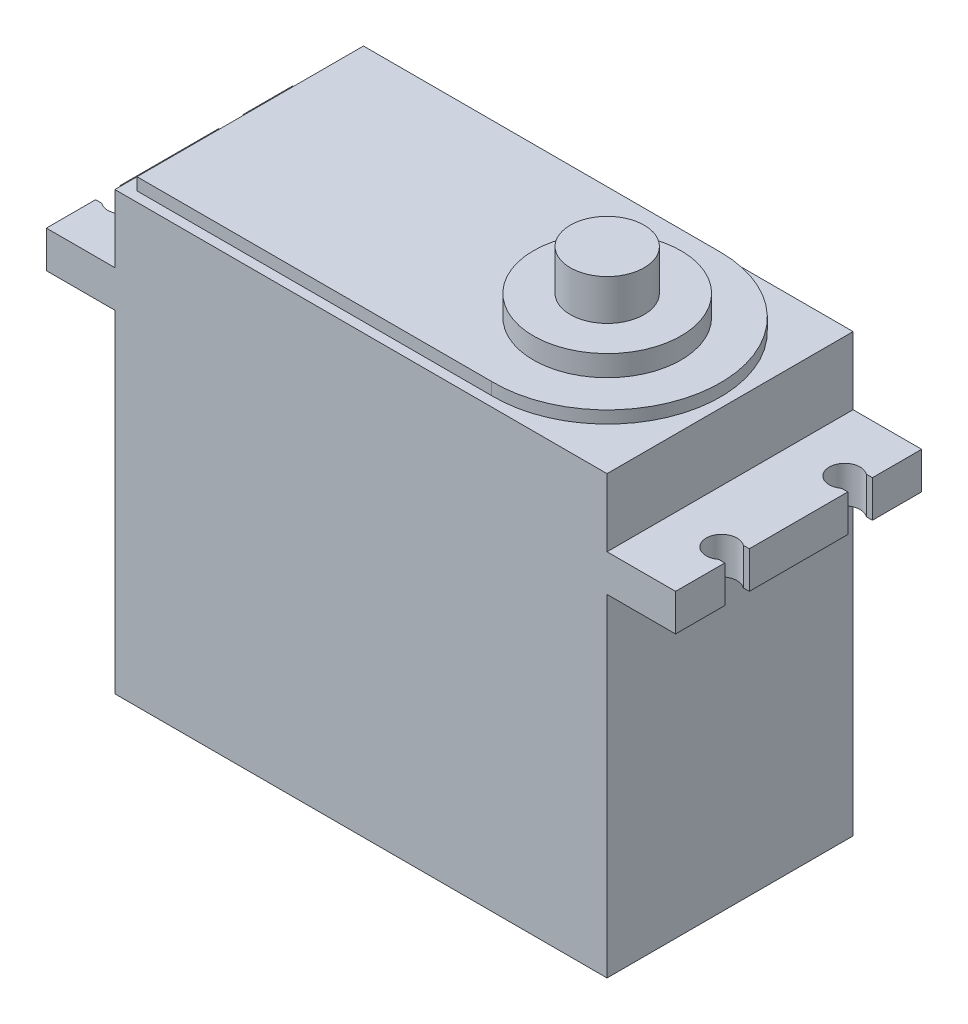
ISO-10303-21;
HEADER;
FILE_DESCRIPTION(('STEP AP214'),'2;1');
FILE_NAME('part.step','',(''),(''),'','','');
FILE_SCHEMA(('AUTOMOTIVE_DESIGN { 1 0 10303 214 1 1 1 1 }'));
ENDSEC;
DATA;
#1=APPLICATION_CONTEXT('core data for automotive mechanical design processes');
#2=APPLICATION_PROTOCOL_DEFINITION('international standard','automotive_design',2000,#1);
#3=PRODUCT_CONTEXT('',#1,'mechanical');
#4=PRODUCT('Part','Part','',(#3));
#5=PRODUCT_RELATED_PRODUCT_CATEGORY('part','',(#4));
#6=PRODUCT_DEFINITION_FORMATION('','',#4);
#7=PRODUCT_DEFINITION_CONTEXT('part definition',#1,'design');
#8=PRODUCT_DEFINITION('design','',#6,#7);
#9=PRODUCT_DEFINITION_SHAPE('','',#8);
#10=(LENGTH_UNIT() NAMED_UNIT(*) SI_UNIT(.MILLI.,.METRE.));
#11=(NAMED_UNIT(*) PLANE_ANGLE_UNIT() SI_UNIT($,.RADIAN.));
#12=(NAMED_UNIT(*) SI_UNIT($,.STERADIAN.) SOLID_ANGLE_UNIT());
#13=UNCERTAINTY_MEASURE_WITH_UNIT(LENGTH_MEASURE(1.E-05),#10,'distance_accuracy_value','');
#14=(GEOMETRIC_REPRESENTATION_CONTEXT(3) GLOBAL_UNCERTAINTY_ASSIGNED_CONTEXT((#13)) GLOBAL_UNIT_ASSIGNED_CONTEXT((#10,
#11,#12)) REPRESENTATION_CONTEXT('',''));
#15=CARTESIAN_POINT('',(0.,0.,0.));
#16=DIRECTION('',(0.,0.,1.));
#17=DIRECTION('',(1.,0.,0.));
#18=AXIS2_PLACEMENT_3D('',#15,#16,#17);
#19=CARTESIAN_POINT('',(20.,4.73208454498427,10.));
#20=DIRECTION('',(0.,-1.,0.));
#21=DIRECTION('',(1.,0.,0.));
#22=AXIS2_PLACEMENT_3D('',#19,#20,#21);
#23=PLANE('',#22);
#24=DIRECTION('',(-1.,0.,0.));
#25=VECTOR('',#24,1.);
#26=CARTESIAN_POINT('',(20.,4.73208454498427,-10.));
#27=LINE('',#26,#25);
#28=CARTESIAN_POINT('',(20.,4.73208454498427,-10.));
#29=VERTEX_POINT('',#28);
#30=CARTESIAN_POINT('',(-20.,4.73208454498424,-10.));
#31=VERTEX_POINT('',#30);
#32=EDGE_CURVE('E373',#29,#31,#27,.T.);
#33=ORIENTED_EDGE('',*,*,#32,.T.);
#34=DIRECTION('',(0.,0.,-1.));
#35=VECTOR('',#34,1.);
#36=CARTESIAN_POINT('',(-20.,4.73208454498424,10.));
#37=LINE('',#36,#35);
#38=CARTESIAN_POINT('',(-20.,4.73208454498424,10.));
#39=VERTEX_POINT('',#38);
#40=EDGE_CURVE('E422',#39,#31,#37,.T.);
#41=ORIENTED_EDGE('',*,*,#40,.F.);
#42=DIRECTION('',(-1.,0.,0.));
#43=VECTOR('',#42,1.);
#44=CARTESIAN_POINT('',(20.,4.73208454498427,10.));
#45=LINE('',#44,#43);
#46=CARTESIAN_POINT('',(20.,4.73208454498427,10.));
#47=VERTEX_POINT('',#46);
#48=EDGE_CURVE('E348',#47,#39,#45,.T.);
#49=ORIENTED_EDGE('',*,*,#48,.F.);
#50=DIRECTION('',(0.,0.,-1.));
#51=VECTOR('',#50,1.);
#52=CARTESIAN_POINT('',(20.,4.73208454498427,10.));
#53=LINE('',#52,#51);
#54=EDGE_CURVE('E425',#47,#29,#53,.T.);
#55=ORIENTED_EDGE('',*,*,#54,.T.);
#56=EDGE_LOOP('',(#33,#41,#49,#55));
#57=FACE_BOUND('',#56,.T.);
#58=DIRECTION('',(0.,0.,1.));
#59=VECTOR('',#58,1.);
#60=CARTESIAN_POINT('',(-19.,4.73208454498424,-9.20251188534956));
#61=LINE('',#60,#59);
#62=CARTESIAN_POINT('',(-19.,4.73208454498424,-9.20251188534956));
#63=VERTEX_POINT('',#62);
#64=CARTESIAN_POINT('',(-19.,4.73208454498424,9.2));
#65=VERTEX_POINT('',#64);
#66=EDGE_CURVE('E263',#63,#65,#61,.T.);
#67=ORIENTED_EDGE('',*,*,#66,.F.);
#68=DIRECTION('',(-1.,0.,0.));
#69=VECTOR('',#68,1.);
#70=CARTESIAN_POINT('',(-19.,4.73208454498424,-9.20251188534956));
#71=LINE('',#70,#69);
#72=CARTESIAN_POINT('',(10.015,4.73208454498426,-9.20251188534956));
#73=VERTEX_POINT('',#72);
#74=EDGE_CURVE('E260',#73,#63,#71,.T.);
#75=ORIENTED_EDGE('',*,*,#74,.F.);
#76=CARTESIAN_POINT('',(10.015,4.73208454498426,0.));
#77=DIRECTION('',(0.,1.,0.));
#78=DIRECTION('',(-1.,0.,0.));
#79=AXIS2_PLACEMENT_3D('',#76,#77,#78);
#80=CIRCLE('',#79,9.20251188534956);
#81=CARTESIAN_POINT('',(9.8,4.73208454498426,9.2));
#82=VERTEX_POINT('',#81);
#83=EDGE_CURVE('E54',#82,#73,#80,.T.);
#84=ORIENTED_EDGE('',*,*,#83,.F.);
#85=DIRECTION('',(1.,0.,0.));
#86=VECTOR('',#85,1.);
#87=CARTESIAN_POINT('',(-19.,4.73208454498424,9.2));
#88=LINE('',#87,#86);
#89=EDGE_CURVE('E49',#65,#82,#88,.T.);
#90=ORIENTED_EDGE('',*,*,#89,.F.);
#91=EDGE_LOOP('',(#67,#75,#84,#90));
#92=FACE_BOUND('',#91,.T.);
#93=ADVANCED_FACE('F33',(#57,#92),#23,.F.);
#94=CARTESIAN_POINT('',(25.5688776328022,-0.767915455015733,10.));
#95=DIRECTION('',(-1.,0.,0.));
#96=DIRECTION('',(0.,0.,1.));
#97=AXIS2_PLACEMENT_3D('',#94,#95,#96);
#98=PLANE('',#97);
#99=DIRECTION('',(0.,0.,-1.));
#100=VECTOR('',#99,1.);
#101=CARTESIAN_POINT('',(25.5688776328022,-0.767915455015733,10.));
#102=LINE('',#101,#100);
#103=CARTESIAN_POINT('',(25.5688776328022,-0.767915455015733,4.));
#104=VERTEX_POINT('',#103);
#105=CARTESIAN_POINT('',(25.5688776328022,-0.767915455015733,-4.));
#106=VERTEX_POINT('',#105);
#107=EDGE_CURVE('E436',#104,#106,#102,.T.);
#108=ORIENTED_EDGE('',*,*,#107,.F.);
#109=DIRECTION('',(0.,1.,0.));
#110=VECTOR('',#109,1.);
#111=CARTESIAN_POINT('',(25.5688776328022,-10.7679154550157,4.));
#112=LINE('',#111,#110);
#113=CARTESIAN_POINT('',(25.5688776328022,-3.76791545501573,4.));
#114=VERTEX_POINT('',#113);
#115=EDGE_CURVE('E283',#114,#104,#112,.T.);
#116=ORIENTED_EDGE('',*,*,#115,.F.);
#117=DIRECTION('',(0.,0.,-1.));
#118=VECTOR('',#117,1.);
#119=CARTESIAN_POINT('',(25.5688776328022,-3.76791545501573,10.));
#120=LINE('',#119,#118);
#121=CARTESIAN_POINT('',(25.5688776328022,-3.76791545501573,-4.));
#122=VERTEX_POINT('',#121);
#123=EDGE_CURVE('E397',#114,#122,#120,.T.);
#124=ORIENTED_EDGE('',*,*,#123,.T.);
#125=DIRECTION('',(0.,1.,0.));
#126=VECTOR('',#125,1.);
#127=CARTESIAN_POINT('',(25.5688776328022,-10.7679154550157,-4.));
#128=LINE('',#127,#126);
#129=EDGE_CURVE('E334',#122,#106,#128,.T.);
#130=ORIENTED_EDGE('',*,*,#129,.T.);
#131=EDGE_LOOP('',(#108,#116,#124,#130));
#132=FACE_BOUND('',#131,.T.);
#133=ADVANCED_FACE('F496',(#132),#98,.F.);
#134=CARTESIAN_POINT('',(-20.,-0.767915455015747,10.));
#135=DIRECTION('',(0.,-1.,0.));
#136=DIRECTION('',(0.,0.,-1.));
#137=AXIS2_PLACEMENT_3D('',#134,#135,#136);
#138=PLANE('',#137);
#139=CARTESIAN_POINT('',(-24.315,-0.767915455015733,-5.));
#140=DIRECTION('',(0.,1.,0.));
#141=DIRECTION('',(0.,0.,1.));
#142=AXIS2_PLACEMENT_3D('',#139,#140,#141);
#143=CIRCLE('',#142,1.25387763280224);
#144=CARTESIAN_POINT('',(-25.07144505289,-0.767915455015733,-5.99999999999999));
#145=VERTEX_POINT('',#144);
#146=CARTESIAN_POINT('',(-25.07144505289,-0.767915455015733,-4.00000000000001));
#147=VERTEX_POINT('',#146);
#148=EDGE_CURVE('E292',#145,#147,#143,.F.);
#149=ORIENTED_EDGE('',*,*,#148,.T.);
#150=DIRECTION('',(1.,0.,0.));
#151=VECTOR('',#150,1.);
#152=CARTESIAN_POINT('',(0.,-0.767915455015733,-4.00000000000062));
#153=LINE('',#152,#151);
#154=CARTESIAN_POINT('',(-25.5688776328022,-0.767915455015733,-3.99999999999999));
#155=VERTEX_POINT('',#154);
#156=EDGE_CURVE('E298',#155,#147,#153,.T.);
#157=ORIENTED_EDGE('',*,*,#156,.F.);
#158=DIRECTION('',(0.,0.,-1.));
#159=VECTOR('',#158,1.);
#160=CARTESIAN_POINT('',(-25.5688776328022,-0.767915455015747,10.));
#161=LINE('',#160,#159);
#162=CARTESIAN_POINT('',(-25.5688776328022,-0.767915455015733,3.99999999999999));
#163=VERTEX_POINT('',#162);
#164=EDGE_CURVE('E419',#163,#155,#161,.T.);
#165=ORIENTED_EDGE('',*,*,#164,.F.);
#166=DIRECTION('',(1.,0.,0.));
#167=VECTOR('',#166,1.);
#168=CARTESIAN_POINT('',(0.,-0.767915455015733,4.00000000000062));
#169=LINE('',#168,#167);
#170=CARTESIAN_POINT('',(-25.07144505289,-0.767915455015733,4.00000000000001));
#171=VERTEX_POINT('',#170);
#172=EDGE_CURVE('E267',#163,#171,#169,.T.);
#173=ORIENTED_EDGE('',*,*,#172,.T.);
#174=CARTESIAN_POINT('',(-24.315,-0.767915455015733,5.));
#175=DIRECTION('',(0.,1.,0.));
#176=DIRECTION('',(0.,0.,1.));
#177=AXIS2_PLACEMENT_3D('',#174,#175,#176);
#178=CIRCLE('',#177,1.25387763280224);
#179=CARTESIAN_POINT('',(-25.07144505289,-0.767915455015733,5.99999999999999));
#180=VERTEX_POINT('',#179);
#181=EDGE_CURVE('E264',#171,#180,#178,.F.);
#182=ORIENTED_EDGE('',*,*,#181,.T.);
#183=DIRECTION('',(-1.,0.,0.));
#184=VECTOR('',#183,1.);
#185=CARTESIAN_POINT('',(1.46468866200668E-13,-0.767915455015733,5.99999999999938));
#186=LINE('',#185,#184);
#187=CARTESIAN_POINT('',(-25.5688776328022,-0.767915455015733,6.00000000000001));
#188=VERTEX_POINT('',#187);
#189=EDGE_CURVE('E311',#180,#188,#186,.T.);
#190=ORIENTED_EDGE('',*,*,#189,.T.);
#191=CARTESIAN_POINT('',(-25.5688776328022,-0.767915455015747,10.));
#192=VERTEX_POINT('',#191);
#193=EDGE_CURVE('E415',#192,#188,#161,.T.);
#194=ORIENTED_EDGE('',*,*,#193,.F.);
#195=DIRECTION('',(-1.,0.,0.));
#196=VECTOR('',#195,1.);
#197=CARTESIAN_POINT('',(-20.,-0.767915455015747,10.));
#198=LINE('',#197,#196);
#199=CARTESIAN_POINT('',(-20.,-0.767915455015747,10.));
#200=VERTEX_POINT('',#199);
#201=EDGE_CURVE('E352',#200,#192,#198,.T.);
#202=ORIENTED_EDGE('',*,*,#201,.F.);
#203=DIRECTION('',(0.,0.,-1.));
#204=VECTOR('',#203,1.);
#205=CARTESIAN_POINT('',(-20.,-0.767915455015747,10.));
#206=LINE('',#205,#204);
#207=CARTESIAN_POINT('',(-20.,-0.767915455015747,-10.));
#208=VERTEX_POINT('',#207);
#209=EDGE_CURVE('E418',#200,#208,#206,.T.);
#210=ORIENTED_EDGE('',*,*,#209,.T.);
#211=DIRECTION('',(-1.,0.,0.));
#212=VECTOR('',#211,1.);
#213=CARTESIAN_POINT('',(-20.,-0.767915455015747,-10.));
#214=LINE('',#213,#212);
#215=CARTESIAN_POINT('',(-25.5688776328022,-0.767915455015747,-10.));
#216=VERTEX_POINT('',#215);
#217=EDGE_CURVE('E377',#208,#216,#214,.T.);
#218=ORIENTED_EDGE('',*,*,#217,.T.);
#219=CARTESIAN_POINT('',(-25.5688776328022,-0.767915455015733,-6.00000000000001));
#220=VERTEX_POINT('',#219);
#221=EDGE_CURVE('E413',#220,#216,#161,.T.);
#222=ORIENTED_EDGE('',*,*,#221,.F.);
#223=DIRECTION('',(-1.,0.,0.));
#224=VECTOR('',#223,1.);
#225=CARTESIAN_POINT('',(1.46468866200668E-13,-0.767915455015733,-5.99999999999938));
#226=LINE('',#225,#224);
#227=EDGE_CURVE('E295',#145,#220,#226,.T.);
#228=ORIENTED_EDGE('',*,*,#227,.F.);
#229=EDGE_LOOP('',(#149,#157,#165,#173,#182,#190,#194,#202,#210,#218,#222,#228));
#230=FACE_BOUND('',#229,.T.);
#231=ADVANCED_FACE('F531',(#230),#138,.F.);
#232=CARTESIAN_POINT('',(-25.5688776328022,-0.767915455015747,10.));
#233=DIRECTION('',(1.,0.,0.));
#234=DIRECTION('',(0.,0.,-1.));
#235=AXIS2_PLACEMENT_3D('',#232,#233,#234);
#236=PLANE('',#235);
#237=ORIENTED_EDGE('',*,*,#164,.T.);
#238=DIRECTION('',(0.,1.,0.));
#239=VECTOR('',#238,1.);
#240=CARTESIAN_POINT('',(-25.5688776328022,-10.7679154550157,-3.99999999999999));
#241=LINE('',#240,#239);
#242=CARTESIAN_POINT('',(-25.5688776328022,-3.76791545501575,-3.99999999999999));
#243=VERTEX_POINT('',#242);
#244=EDGE_CURVE('E303',#243,#155,#241,.T.);
#245=ORIENTED_EDGE('',*,*,#244,.F.);
#246=DIRECTION('',(0.,0.,-1.));
#247=VECTOR('',#246,1.);
#248=CARTESIAN_POINT('',(-25.5688776328022,-3.76791545501575,10.));
#249=LINE('',#248,#247);
#250=CARTESIAN_POINT('',(-25.5688776328022,-3.76791545501575,4.));
#251=VERTEX_POINT('',#250);
#252=EDGE_CURVE('E414',#251,#243,#249,.T.);
#253=ORIENTED_EDGE('',*,*,#252,.F.);
#254=DIRECTION('',(0.,1.,0.));
#255=VECTOR('',#254,1.);
#256=CARTESIAN_POINT('',(-25.5688776328022,-10.7679154550157,3.99999999999999));
#257=LINE('',#256,#255);
#258=EDGE_CURVE('E318',#251,#163,#257,.T.);
#259=ORIENTED_EDGE('',*,*,#258,.T.);
#260=EDGE_LOOP('',(#237,#245,#253,#259));
#261=FACE_BOUND('',#260,.T.);
#262=ADVANCED_FACE('F588',(#261),#236,.F.);
#263=DIRECTION('',(0.,1.,0.));
#264=VECTOR('',#263,1.);
#265=CARTESIAN_POINT('',(-25.5688776328022,-10.7679154550157,6.00000000000001));
#266=LINE('',#265,#264);
#267=CARTESIAN_POINT('',(-25.5688776328022,-3.76791545501575,6.00000000000001));
#268=VERTEX_POINT('',#267);
#269=EDGE_CURVE('E316',#268,#188,#266,.T.);
#270=ORIENTED_EDGE('',*,*,#269,.F.);
#271=CARTESIAN_POINT('',(-25.5688776328022,-3.76791545501575,10.));
#272=VERTEX_POINT('',#271);
#273=EDGE_CURVE('E410',#272,#268,#249,.T.);
#274=ORIENTED_EDGE('',*,*,#273,.F.);
#275=DIRECTION('',(0.,-1.,0.));
#276=VECTOR('',#275,1.);
#277=CARTESIAN_POINT('',(-25.5688776328022,-0.767915455015747,10.));
#278=LINE('',#277,#276);
#279=EDGE_CURVE('E354',#192,#272,#278,.T.);
#280=ORIENTED_EDGE('',*,*,#279,.F.);
#281=ORIENTED_EDGE('',*,*,#193,.T.);
#282=EDGE_LOOP('',(#270,#274,#280,#281));
#283=FACE_BOUND('',#282,.T.);
#284=ADVANCED_FACE('F535',(#283),#236,.F.);
#285=CARTESIAN_POINT('',(-25.5688776328022,-3.76791545501575,-6.));
#286=VERTEX_POINT('',#285);
#287=CARTESIAN_POINT('',(-25.5688776328022,-3.76791545501575,-10.));
#288=VERTEX_POINT('',#287);
#289=EDGE_CURVE('E409',#286,#288,#249,.T.);
#290=ORIENTED_EDGE('',*,*,#289,.F.);
#291=DIRECTION('',(0.,1.,0.));
#292=VECTOR('',#291,1.);
#293=CARTESIAN_POINT('',(-25.5688776328022,-10.7679154550157,-6.00000000000001));
#294=LINE('',#293,#292);
#295=EDGE_CURVE('E305',#286,#220,#294,.T.);
#296=ORIENTED_EDGE('',*,*,#295,.T.);
#297=ORIENTED_EDGE('',*,*,#221,.T.);
#298=DIRECTION('',(0.,-1.,0.));
#299=VECTOR('',#298,1.);
#300=CARTESIAN_POINT('',(-25.5688776328022,-0.767915455015747,-10.));
#301=LINE('',#300,#299);
#302=EDGE_CURVE('E380',#216,#288,#301,.T.);
#303=ORIENTED_EDGE('',*,*,#302,.T.);
#304=EDGE_LOOP('',(#290,#296,#297,#303));
#305=FACE_BOUND('',#304,.T.);
#306=ADVANCED_FACE('F581',(#305),#236,.F.);
#307=CARTESIAN_POINT('',(-25.5688776328022,-3.76791545501575,10.));
#308=DIRECTION('',(0.,1.,0.));
#309=DIRECTION('',(-1.,0.,0.));
#310=AXIS2_PLACEMENT_3D('',#307,#308,#309);
#311=PLANE('',#310);
#312=ORIENTED_EDGE('',*,*,#252,.T.);
#313=DIRECTION('',(1.,0.,0.));
#314=VECTOR('',#313,1.);
#315=CARTESIAN_POINT('',(-25.5688776328026,-3.76791545501575,-3.99999999999999));
#316=LINE('',#315,#314);
#317=CARTESIAN_POINT('',(-25.07144505289,-3.76791545501575,-4.00000000000001));
#318=VERTEX_POINT('',#317);
#319=EDGE_CURVE('E455',#243,#318,#316,.T.);
#320=ORIENTED_EDGE('',*,*,#319,.T.);
#321=CARTESIAN_POINT('',(-24.315,-3.76791545501575,-5.));
#322=DIRECTION('',(0.,1.,0.));
#323=DIRECTION('',(-1.,0.,0.));
#324=AXIS2_PLACEMENT_3D('',#321,#322,#323);
#325=CIRCLE('',#324,1.25387763280224);
#326=CARTESIAN_POINT('',(-25.07144505289,-3.76791545501575,-5.99999999999999));
#327=VERTEX_POINT('',#326);
#328=EDGE_CURVE('E453',#327,#318,#325,.F.);
#329=ORIENTED_EDGE('',*,*,#328,.F.);
#330=DIRECTION('',(-1.,0.,0.));
#331=VECTOR('',#330,1.);
#332=CARTESIAN_POINT('',(-25.5688776328018,-3.76791545501575,-6.00000000000001));
#333=LINE('',#332,#331);
#334=EDGE_CURVE('E450',#327,#286,#333,.T.);
#335=ORIENTED_EDGE('',*,*,#334,.T.);
#336=ORIENTED_EDGE('',*,*,#289,.T.);
#337=DIRECTION('',(1.,0.,0.));
#338=VECTOR('',#337,1.);
#339=CARTESIAN_POINT('',(-25.5688776328022,-3.76791545501575,-10.));
#340=LINE('',#339,#338);
#341=CARTESIAN_POINT('',(-20.,-3.76791545501575,-10.));
#342=VERTEX_POINT('',#341);
#343=EDGE_CURVE('E383',#288,#342,#340,.T.);
#344=ORIENTED_EDGE('',*,*,#343,.T.);
#345=DIRECTION('',(0.,0.,-1.));
#346=VECTOR('',#345,1.);
#347=CARTESIAN_POINT('',(-20.,-3.76791545501575,10.));
#348=LINE('',#347,#346);
#349=CARTESIAN_POINT('',(-20.,-3.76791545501575,10.));
#350=VERTEX_POINT('',#349);
#351=EDGE_CURVE('E406',#350,#342,#348,.T.);
#352=ORIENTED_EDGE('',*,*,#351,.F.);
#353=DIRECTION('',(1.,0.,0.));
#354=VECTOR('',#353,1.);
#355=CARTESIAN_POINT('',(-25.5688776328022,-3.76791545501575,10.));
#356=LINE('',#355,#354);
#357=EDGE_CURVE('E356',#272,#350,#356,.T.);
#358=ORIENTED_EDGE('',*,*,#357,.F.);
#359=ORIENTED_EDGE('',*,*,#273,.T.);
#360=DIRECTION('',(-1.,0.,0.));
#361=VECTOR('',#360,1.);
#362=CARTESIAN_POINT('',(-25.5688776328023,-3.76791545501575,6.00000000000001));
#363=LINE('',#362,#361);
#364=CARTESIAN_POINT('',(-25.07144505289,-3.76791545501575,5.99999999999999));
#365=VERTEX_POINT('',#364);
#366=EDGE_CURVE('E448',#365,#268,#363,.T.);
#367=ORIENTED_EDGE('',*,*,#366,.F.);
#368=CARTESIAN_POINT('',(-24.315,-3.76791545501575,5.));
#369=DIRECTION('',(0.,1.,0.));
#370=DIRECTION('',(-1.,0.,0.));
#371=AXIS2_PLACEMENT_3D('',#368,#369,#370);
#372=CIRCLE('',#371,1.25387763280224);
#373=CARTESIAN_POINT('',(-25.07144505289,-3.76791545501575,4.00000000000001));
#374=VERTEX_POINT('',#373);
#375=EDGE_CURVE('E446',#374,#365,#372,.F.);
#376=ORIENTED_EDGE('',*,*,#375,.F.);
#377=DIRECTION('',(1.,0.,0.));
#378=VECTOR('',#377,1.);
#379=CARTESIAN_POINT('',(-25.5688776328021,-3.76791545501575,3.99999999999999));
#380=LINE('',#379,#378);
#381=EDGE_CURVE('E444',#251,#374,#380,.T.);
#382=ORIENTED_EDGE('',*,*,#381,.F.);
#383=EDGE_LOOP('',(#312,#320,#329,#335,#336,#344,#352,#358,#359,#367,#376,#382));
#384=FACE_BOUND('',#383,.T.);
#385=ADVANCED_FACE('F541',(#384),#311,.F.);
#386=DIRECTION('',(0.,1.,0.));
#387=VECTOR('',#386,1.);
#388=CARTESIAN_POINT('',(25.5688776328022,-10.7679154550157,-6.));
#389=LINE('',#388,#387);
#390=CARTESIAN_POINT('',(25.5688776328022,-3.76791545501573,-6.));
#391=VERTEX_POINT('',#390);
#392=CARTESIAN_POINT('',(25.5688776328022,-0.767915455015733,-6.));
#393=VERTEX_POINT('',#392);
#394=EDGE_CURVE('E331',#391,#393,#389,.T.);
#395=ORIENTED_EDGE('',*,*,#394,.F.);
#396=CARTESIAN_POINT('',(25.5688776328022,-3.76791545501573,-10.));
#397=VERTEX_POINT('',#396);
#398=EDGE_CURVE('E366',#391,#397,#120,.T.);
#399=ORIENTED_EDGE('',*,*,#398,.T.);
#400=DIRECTION('',(0.,1.,0.));
#401=VECTOR('',#400,1.);
#402=CARTESIAN_POINT('',(25.5688776328022,-0.767915455015733,-10.));
#403=LINE('',#402,#401);
#404=CARTESIAN_POINT('',(25.5688776328022,-0.767915455015733,-10.));
#405=VERTEX_POINT('',#404);
#406=EDGE_CURVE('E333',#397,#405,#403,.T.);
#407=ORIENTED_EDGE('',*,*,#406,.T.);
#408=EDGE_CURVE('E431',#393,#405,#102,.T.);
#409=ORIENTED_EDGE('',*,*,#408,.F.);
#410=EDGE_LOOP('',(#395,#399,#407,#409));
#411=FACE_BOUND('',#410,.T.);
#412=ADVANCED_FACE('F35',(#411),#98,.F.);
#413=CARTESIAN_POINT('',(25.5688776328022,-3.76791545501573,10.));
#414=VERTEX_POINT('',#413);
#415=CARTESIAN_POINT('',(25.5688776328022,-3.76791545501573,6.));
#416=VERTEX_POINT('',#415);
#417=EDGE_CURVE('E393',#414,#416,#120,.T.);
#418=ORIENTED_EDGE('',*,*,#417,.T.);
#419=DIRECTION('',(0.,1.,0.));
#420=VECTOR('',#419,1.);
#421=CARTESIAN_POINT('',(25.5688776328022,-10.7679154550157,6.));
#422=LINE('',#421,#420);
#423=CARTESIAN_POINT('',(25.5688776328022,-0.767915455015733,6.));
#424=VERTEX_POINT('',#423);
#425=EDGE_CURVE('E286',#416,#424,#422,.T.);
#426=ORIENTED_EDGE('',*,*,#425,.T.);
#427=CARTESIAN_POINT('',(25.5688776328022,-0.767915455015733,10.));
#428=VERTEX_POINT('',#427);
#429=EDGE_CURVE('E432',#428,#424,#102,.T.);
#430=ORIENTED_EDGE('',*,*,#429,.F.);
#431=DIRECTION('',(0.,1.,0.));
#432=VECTOR('',#431,1.);
#433=CARTESIAN_POINT('',(25.5688776328022,-0.767915455015733,10.));
#434=LINE('',#433,#432);
#435=EDGE_CURVE('E340',#414,#428,#434,.T.);
#436=ORIENTED_EDGE('',*,*,#435,.F.);
#437=EDGE_LOOP('',(#418,#426,#430,#436));
#438=FACE_BOUND('',#437,.T.);
#439=ADVANCED_FACE('F471',(#438),#98,.F.);
#440=CARTESIAN_POINT('',(20.,-0.767915455015733,10.));
#441=DIRECTION('',(0.,-1.,0.));
#442=DIRECTION('',(0.,0.,-1.));
#443=AXIS2_PLACEMENT_3D('',#440,#441,#442);
#444=PLANE('',#443);
#445=CARTESIAN_POINT('',(24.315,-0.767915455015733,5.));
#446=DIRECTION('',(0.,1.,0.));
#447=DIRECTION('',(0.,0.,1.));
#448=AXIS2_PLACEMENT_3D('',#445,#446,#447);
#449=CIRCLE('',#448,1.25387763280224);
#450=CARTESIAN_POINT('',(25.07144505289,-0.767915455015733,4.));
#451=VERTEX_POINT('',#450);
#452=CARTESIAN_POINT('',(25.07144505289,-0.767915455015733,6.));
#453=VERTEX_POINT('',#452);
#454=EDGE_CURVE('E276',#451,#453,#449,.T.);
#455=ORIENTED_EDGE('',*,*,#454,.F.);
#456=DIRECTION('',(-1.,0.,0.));
#457=VECTOR('',#456,1.);
#458=CARTESIAN_POINT('',(0.,-0.767915455015733,4.));
#459=LINE('',#458,#457);
#460=EDGE_CURVE('E273',#104,#451,#459,.T.);
#461=ORIENTED_EDGE('',*,*,#460,.F.);
#462=ORIENTED_EDGE('',*,*,#107,.T.);
#463=DIRECTION('',(-1.,0.,0.));
#464=VECTOR('',#463,1.);
#465=CARTESIAN_POINT('',(0.,-0.767915455015733,-4.));
#466=LINE('',#465,#464);
#467=CARTESIAN_POINT('',(25.07144505289,-0.767915455015733,-4.));
#468=VERTEX_POINT('',#467);
#469=EDGE_CURVE('E327',#106,#468,#466,.T.);
#470=ORIENTED_EDGE('',*,*,#469,.T.);
#471=CARTESIAN_POINT('',(24.315,-0.767915455015733,-5.));
#472=DIRECTION('',(0.,1.,0.));
#473=DIRECTION('',(0.,0.,1.));
#474=AXIS2_PLACEMENT_3D('',#471,#472,#473);
#475=CIRCLE('',#474,1.25387763280224);
#476=CARTESIAN_POINT('',(25.07144505289,-0.767915455015733,-6.));
#477=VERTEX_POINT('',#476);
#478=EDGE_CURVE('E324',#477,#468,#475,.T.);
#479=ORIENTED_EDGE('',*,*,#478,.F.);
#480=DIRECTION('',(1.,0.,0.));
#481=VECTOR('',#480,1.);
#482=CARTESIAN_POINT('',(0.,-0.767915455015733,-6.));
#483=LINE('',#482,#481);
#484=EDGE_CURVE('E285',#477,#393,#483,.T.);
#485=ORIENTED_EDGE('',*,*,#484,.T.);
#486=ORIENTED_EDGE('',*,*,#408,.T.);
#487=DIRECTION('',(-1.,0.,0.));
#488=VECTOR('',#487,1.);
#489=CARTESIAN_POINT('',(20.,-0.767915455015733,-10.));
#490=LINE('',#489,#488);
#491=CARTESIAN_POINT('',(20.,-0.767915455015733,-10.));
#492=VERTEX_POINT('',#491);
#493=EDGE_CURVE('E369',#405,#492,#490,.T.);
#494=ORIENTED_EDGE('',*,*,#493,.T.);
#495=DIRECTION('',(0.,0.,-1.));
#496=VECTOR('',#495,1.);
#497=CARTESIAN_POINT('',(20.,-0.767915455015733,10.));
#498=LINE('',#497,#496);
#499=CARTESIAN_POINT('',(20.,-0.767915455015733,10.));
#500=VERTEX_POINT('',#499);
#501=EDGE_CURVE('E428',#500,#492,#498,.T.);
#502=ORIENTED_EDGE('',*,*,#501,.F.);
#503=DIRECTION('',(-1.,0.,0.));
#504=VECTOR('',#503,1.);
#505=CARTESIAN_POINT('',(20.,-0.767915455015733,10.));
#506=LINE('',#505,#504);
#507=EDGE_CURVE('E343',#428,#500,#506,.T.);
#508=ORIENTED_EDGE('',*,*,#507,.F.);
#509=ORIENTED_EDGE('',*,*,#429,.T.);
#510=DIRECTION('',(1.,0.,0.));
#511=VECTOR('',#510,1.);
#512=CARTESIAN_POINT('',(0.,-0.767915455015733,6.));
#513=LINE('',#512,#511);
#514=EDGE_CURVE('E280',#453,#424,#513,.T.);
#515=ORIENTED_EDGE('',*,*,#514,.F.);
#516=EDGE_LOOP('',(#455,#461,#462,#470,#479,#485,#486,#494,#502,#508,#509,#515));
#517=FACE_BOUND('',#516,.T.);
#518=ADVANCED_FACE('F510',(#517),#444,.F.);
#519=CARTESIAN_POINT('',(25.5688776328022,-3.76791545501573,10.));
#520=DIRECTION('',(0.,1.,0.));
#521=DIRECTION('',(-1.,0.,0.));
#522=AXIS2_PLACEMENT_3D('',#519,#520,#521);
#523=PLANE('',#522);
#524=ORIENTED_EDGE('',*,*,#123,.F.);
#525=DIRECTION('',(-1.,0.,0.));
#526=VECTOR('',#525,1.);
#527=CARTESIAN_POINT('',(25.5688776328022,-3.76791545501573,4.));
#528=LINE('',#527,#526);
#529=CARTESIAN_POINT('',(25.07144505289,-3.76791545501573,4.));
#530=VERTEX_POINT('',#529);
#531=EDGE_CURVE('E11',#114,#530,#528,.T.);
#532=ORIENTED_EDGE('',*,*,#531,.T.);
#533=CARTESIAN_POINT('',(24.315,-3.76791545501573,5.));
#534=DIRECTION('',(0.,1.,0.));
#535=DIRECTION('',(-1.,0.,0.));
#536=AXIS2_PLACEMENT_3D('',#533,#534,#535);
#537=CIRCLE('',#536,1.25387763280224);
#538=CARTESIAN_POINT('',(25.07144505289,-3.76791545501573,6.));
#539=VERTEX_POINT('',#538);
#540=EDGE_CURVE('E458',#530,#539,#537,.T.);
#541=ORIENTED_EDGE('',*,*,#540,.T.);
#542=DIRECTION('',(1.,0.,0.));
#543=VECTOR('',#542,1.);
#544=CARTESIAN_POINT('',(25.5688776328022,-3.76791545501573,6.));
#545=LINE('',#544,#543);
#546=EDGE_CURVE('E42',#539,#416,#545,.T.);
#547=ORIENTED_EDGE('',*,*,#546,.T.);
#548=ORIENTED_EDGE('',*,*,#417,.F.);
#549=DIRECTION('',(1.,0.,0.));
#550=VECTOR('',#549,1.);
#551=CARTESIAN_POINT('',(25.5688776328022,-3.76791545501573,10.));
#552=LINE('',#551,#550);
#553=CARTESIAN_POINT('',(20.,-3.76791545501573,10.));
#554=VERTEX_POINT('',#553);
#555=EDGE_CURVE('E364',#554,#414,#552,.T.);
#556=ORIENTED_EDGE('',*,*,#555,.F.);
#557=DIRECTION('',(0.,0.,-1.));
#558=VECTOR('',#557,1.);
#559=CARTESIAN_POINT('',(20.,-3.76791545501573,10.));
#560=LINE('',#559,#558);
#561=CARTESIAN_POINT('',(20.,-3.76791545501573,-10.));
#562=VERTEX_POINT('',#561);
#563=EDGE_CURVE('E396',#554,#562,#560,.T.);
#564=ORIENTED_EDGE('',*,*,#563,.T.);
#565=DIRECTION('',(1.,0.,0.));
#566=VECTOR('',#565,1.);
#567=CARTESIAN_POINT('',(25.5688776328022,-3.76791545501573,-10.));
#568=LINE('',#567,#566);
#569=EDGE_CURVE('E344',#562,#397,#568,.T.);
#570=ORIENTED_EDGE('',*,*,#569,.T.);
#571=ORIENTED_EDGE('',*,*,#398,.F.);
#572=DIRECTION('',(1.,0.,0.));
#573=VECTOR('',#572,1.);
#574=CARTESIAN_POINT('',(25.5688776328022,-3.76791545501573,-6.));
#575=LINE('',#574,#573);
#576=CARTESIAN_POINT('',(25.07144505289,-3.76791545501573,-6.));
#577=VERTEX_POINT('',#576);
#578=EDGE_CURVE('E442',#577,#391,#575,.T.);
#579=ORIENTED_EDGE('',*,*,#578,.F.);
#580=CARTESIAN_POINT('',(24.315,-3.76791545501573,-5.));
#581=DIRECTION('',(0.,1.,0.));
#582=DIRECTION('',(-1.,0.,0.));
#583=AXIS2_PLACEMENT_3D('',#580,#581,#582);
#584=CIRCLE('',#583,1.25387763280224);
#585=CARTESIAN_POINT('',(25.07144505289,-3.76791545501573,-4.));
#586=VERTEX_POINT('',#585);
#587=EDGE_CURVE('E435',#577,#586,#584,.T.);
#588=ORIENTED_EDGE('',*,*,#587,.T.);
#589=DIRECTION('',(-1.,0.,0.));
#590=VECTOR('',#589,1.);
#591=CARTESIAN_POINT('',(25.5688776328022,-3.76791545501573,-4.));
#592=LINE('',#591,#590);
#593=EDGE_CURVE('E439',#122,#586,#592,.T.);
#594=ORIENTED_EDGE('',*,*,#593,.F.);
#595=EDGE_LOOP('',(#524,#532,#541,#547,#548,#556,#564,#570,#571,#579,#588,#594));
#596=FACE_BOUND('',#595,.T.);
#597=ADVANCED_FACE('F466',(#596),#523,.F.);
#598=CARTESIAN_POINT('',(20.,-0.767915455015733,10.));
#599=DIRECTION('',(-1.,0.,0.));
#600=DIRECTION('',(0.,0.,1.));
#601=AXIS2_PLACEMENT_3D('',#598,#599,#600);
#602=PLANE('',#601);
#603=DIRECTION('',(0.,1.,0.));
#604=VECTOR('',#603,1.);
#605=CARTESIAN_POINT('',(20.,-0.767915455015733,-10.));
#606=LINE('',#605,#604);
#607=EDGE_CURVE('E371',#492,#29,#606,.T.);
#608=ORIENTED_EDGE('',*,*,#607,.T.);
#609=ORIENTED_EDGE('',*,*,#54,.F.);
#610=DIRECTION('',(0.,1.,0.));
#611=VECTOR('',#610,1.);
#612=CARTESIAN_POINT('',(20.,-0.767915455015733,10.));
#613=LINE('',#612,#611);
#614=EDGE_CURVE('E346',#500,#47,#613,.T.);
#615=ORIENTED_EDGE('',*,*,#614,.F.);
#616=ORIENTED_EDGE('',*,*,#501,.T.);
#617=EDGE_LOOP('',(#608,#609,#615,#616));
#618=FACE_BOUND('',#617,.T.);
#619=ADVANCED_FACE('F514',(#618),#602,.F.);
#620=CARTESIAN_POINT('',(-20.,-0.767915455015747,10.));
#621=DIRECTION('',(1.,0.,0.));
#622=DIRECTION('',(0.,0.,-1.));
#623=AXIS2_PLACEMENT_3D('',#620,#621,#622);
#624=PLANE('',#623);
#625=DIRECTION('',(0.,-1.,0.));
#626=VECTOR('',#625,1.);
#627=CARTESIAN_POINT('',(-20.,-0.767915455015747,-10.));
#628=LINE('',#627,#626);
#629=EDGE_CURVE('E375',#31,#208,#628,.T.);
#630=ORIENTED_EDGE('',*,*,#629,.T.);
#631=ORIENTED_EDGE('',*,*,#209,.F.);
#632=DIRECTION('',(0.,-1.,0.));
#633=VECTOR('',#632,1.);
#634=CARTESIAN_POINT('',(-20.,-0.767915455015747,10.));
#635=LINE('',#634,#633);
#636=EDGE_CURVE('E350',#39,#200,#635,.T.);
#637=ORIENTED_EDGE('',*,*,#636,.F.);
#638=ORIENTED_EDGE('',*,*,#40,.T.);
#639=EDGE_LOOP('',(#630,#631,#637,#638));
#640=FACE_BOUND('',#639,.T.);
#641=ADVANCED_FACE('F524',(#640),#624,.F.);
#642=CARTESIAN_POINT('',(-20.,-3.76791545501575,10.));
#643=DIRECTION('',(1.,0.,0.));
#644=DIRECTION('',(0.,0.,-1.));
#645=AXIS2_PLACEMENT_3D('',#642,#643,#644);
#646=PLANE('',#645);
#647=DIRECTION('',(0.,-1.,0.));
#648=VECTOR('',#647,1.);
#649=CARTESIAN_POINT('',(-20.,-3.76791545501575,-10.));
#650=LINE('',#649,#648);
#651=CARTESIAN_POINT('',(-20.,-30.7679154550157,-10.));
#652=VERTEX_POINT('',#651);
#653=EDGE_CURVE('E385',#342,#652,#650,.T.);
#654=ORIENTED_EDGE('',*,*,#653,.T.);
#655=DIRECTION('',(0.,0.,-1.));
#656=VECTOR('',#655,1.);
#657=CARTESIAN_POINT('',(-20.,-30.7679154550157,10.));
#658=LINE('',#657,#656);
#659=CARTESIAN_POINT('',(-20.,-30.7679154550157,10.));
#660=VERTEX_POINT('',#659);
#661=EDGE_CURVE('E403',#660,#652,#658,.T.);
#662=ORIENTED_EDGE('',*,*,#661,.F.);
#663=DIRECTION('',(0.,-1.,0.));
#664=VECTOR('',#663,1.);
#665=CARTESIAN_POINT('',(-20.,-3.76791545501575,10.));
#666=LINE('',#665,#664);
#667=EDGE_CURVE('E358',#350,#660,#666,.T.);
#668=ORIENTED_EDGE('',*,*,#667,.F.);
#669=ORIENTED_EDGE('',*,*,#351,.T.);
#670=EDGE_LOOP('',(#654,#662,#668,#669));
#671=FACE_BOUND('',#670,.T.);
#672=ADVANCED_FACE('F547',(#671),#646,.F.);
#673=CARTESIAN_POINT('',(20.,-30.7679154550157,10.));
#674=DIRECTION('',(0.,1.,0.));
#675=DIRECTION('',(0.,0.,1.));
#676=AXIS2_PLACEMENT_3D('',#673,#674,#675);
#677=PLANE('',#676);
#678=DIRECTION('',(1.,0.,0.));
#679=VECTOR('',#678,1.);
#680=CARTESIAN_POINT('',(20.,-30.7679154550157,-10.));
#681=LINE('',#680,#679);
#682=CARTESIAN_POINT('',(20.,-30.7679154550157,-10.));
#683=VERTEX_POINT('',#682);
#684=EDGE_CURVE('E387',#652,#683,#681,.T.);
#685=ORIENTED_EDGE('',*,*,#684,.T.);
#686=DIRECTION('',(0.,0.,-1.));
#687=VECTOR('',#686,1.);
#688=CARTESIAN_POINT('',(20.,-30.7679154550157,10.));
#689=LINE('',#688,#687);
#690=CARTESIAN_POINT('',(20.,-30.7679154550157,10.));
#691=VERTEX_POINT('',#690);
#692=EDGE_CURVE('E400',#691,#683,#689,.T.);
#693=ORIENTED_EDGE('',*,*,#692,.F.);
#694=DIRECTION('',(1.,0.,0.));
#695=VECTOR('',#694,1.);
#696=CARTESIAN_POINT('',(20.,-30.7679154550157,10.));
#697=LINE('',#696,#695);
#698=EDGE_CURVE('E360',#660,#691,#697,.T.);
#699=ORIENTED_EDGE('',*,*,#698,.F.);
#700=ORIENTED_EDGE('',*,*,#661,.T.);
#701=EDGE_LOOP('',(#685,#693,#699,#700));
#702=FACE_BOUND('',#701,.T.);
#703=ADVANCED_FACE('F550',(#702),#677,.F.);
#704=CARTESIAN_POINT('',(20.,-3.76791545501573,10.));
#705=DIRECTION('',(-1.,0.,0.));
#706=DIRECTION('',(0.,0.,1.));
#707=AXIS2_PLACEMENT_3D('',#704,#705,#706);
#708=PLANE('',#707);
#709=DIRECTION('',(0.,1.,0.));
#710=VECTOR('',#709,1.);
#711=CARTESIAN_POINT('',(20.,-3.76791545501573,-10.));
#712=LINE('',#711,#710);
#713=EDGE_CURVE('E389',#683,#562,#712,.T.);
#714=ORIENTED_EDGE('',*,*,#713,.T.);
#715=ORIENTED_EDGE('',*,*,#563,.F.);
#716=DIRECTION('',(0.,1.,0.));
#717=VECTOR('',#716,1.);
#718=CARTESIAN_POINT('',(20.,-3.76791545501573,10.));
#719=LINE('',#718,#717);
#720=EDGE_CURVE('E362',#691,#554,#719,.T.);
#721=ORIENTED_EDGE('',*,*,#720,.F.);
#722=ORIENTED_EDGE('',*,*,#692,.T.);
#723=EDGE_LOOP('',(#714,#715,#721,#722));
#724=FACE_BOUND('',#723,.T.);
#725=ADVANCED_FACE('F551',(#724),#708,.F.);
#726=CARTESIAN_POINT('',(0.,0.,10.));
#727=DIRECTION('',(0.,0.,-1.));
#728=DIRECTION('',(-1.,0.,0.));
#729=AXIS2_PLACEMENT_3D('',#726,#727,#728);
#730=PLANE('',#729);
#731=ORIENTED_EDGE('',*,*,#435,.T.);
#732=ORIENTED_EDGE('',*,*,#507,.T.);
#733=ORIENTED_EDGE('',*,*,#614,.T.);
#734=ORIENTED_EDGE('',*,*,#48,.T.);
#735=ORIENTED_EDGE('',*,*,#636,.T.);
#736=ORIENTED_EDGE('',*,*,#201,.T.);
#737=ORIENTED_EDGE('',*,*,#279,.T.);
#738=ORIENTED_EDGE('',*,*,#357,.T.);
#739=ORIENTED_EDGE('',*,*,#667,.T.);
#740=ORIENTED_EDGE('',*,*,#698,.T.);
#741=ORIENTED_EDGE('',*,*,#720,.T.);
#742=ORIENTED_EDGE('',*,*,#555,.T.);
#743=EDGE_LOOP('',(#731,#732,#733,#734,#735,#736,#737,#738,#739,#740,#741,#742));
#744=FACE_BOUND('',#743,.T.);
#745=ADVANCED_FACE('F474',(#744),#730,.F.);
#746=CARTESIAN_POINT('',(0.,0.,-10.));
#747=DIRECTION('',(0.,0.,-1.));
#748=DIRECTION('',(-1.,0.,0.));
#749=AXIS2_PLACEMENT_3D('',#746,#747,#748);
#750=PLANE('',#749);
#751=ORIENTED_EDGE('',*,*,#406,.F.);
#752=ORIENTED_EDGE('',*,*,#569,.F.);
#753=ORIENTED_EDGE('',*,*,#713,.F.);
#754=ORIENTED_EDGE('',*,*,#684,.F.);
#755=ORIENTED_EDGE('',*,*,#653,.F.);
#756=ORIENTED_EDGE('',*,*,#343,.F.);
#757=ORIENTED_EDGE('',*,*,#302,.F.);
#758=ORIENTED_EDGE('',*,*,#217,.F.);
#759=ORIENTED_EDGE('',*,*,#629,.F.);
#760=ORIENTED_EDGE('',*,*,#32,.F.);
#761=ORIENTED_EDGE('',*,*,#607,.F.);
#762=ORIENTED_EDGE('',*,*,#493,.F.);
#763=EDGE_LOOP('',(#751,#752,#753,#754,#755,#756,#757,#758,#759,#760,#761,#762));
#764=FACE_BOUND('',#763,.T.);
#765=ADVANCED_FACE('F484',(#764),#750,.T.);
#766=CARTESIAN_POINT('',(0.,-10.7679154550157,-6.));
#767=DIRECTION('',(0.,0.,1.));
#768=DIRECTION('',(1.,0.,0.));
#769=AXIS2_PLACEMENT_3D('',#766,#767,#768);
#770=PLANE('',#769);
#771=ORIENTED_EDGE('',*,*,#578,.T.);
#772=ORIENTED_EDGE('',*,*,#394,.T.);
#773=ORIENTED_EDGE('',*,*,#484,.F.);
#774=DIRECTION('',(0.,1.,0.));
#775=VECTOR('',#774,1.);
#776=CARTESIAN_POINT('',(25.07144505289,-10.7679154550157,-6.));
#777=LINE('',#776,#775);
#778=EDGE_CURVE('E330',#577,#477,#777,.T.);
#779=ORIENTED_EDGE('',*,*,#778,.F.);
#780=EDGE_LOOP('',(#771,#772,#773,#779));
#781=FACE_BOUND('',#780,.T.);
#782=ADVANCED_FACE('F506',(#781),#770,.T.);
#783=CARTESIAN_POINT('',(0.,-10.7679154550157,-4.));
#784=DIRECTION('',(0.,0.,-1.));
#785=DIRECTION('',(-1.,0.,0.));
#786=AXIS2_PLACEMENT_3D('',#783,#784,#785);
#787=PLANE('',#786);
#788=ORIENTED_EDGE('',*,*,#593,.T.);
#789=DIRECTION('',(0.,1.,0.));
#790=VECTOR('',#789,1.);
#791=CARTESIAN_POINT('',(25.07144505289,-10.7679154550157,-4.));
#792=LINE('',#791,#790);
#793=EDGE_CURVE('E337',#586,#468,#792,.T.);
#794=ORIENTED_EDGE('',*,*,#793,.T.);
#795=ORIENTED_EDGE('',*,*,#469,.F.);
#796=ORIENTED_EDGE('',*,*,#129,.F.);
#797=EDGE_LOOP('',(#788,#794,#795,#796));
#798=FACE_BOUND('',#797,.T.);
#799=ADVANCED_FACE('F500',(#798),#787,.T.);
#800=CARTESIAN_POINT('',(24.315,-10.7679154550157,-5.));
#801=DIRECTION('',(0.,1.,0.));
#802=DIRECTION('',(0.,0.,1.));
#803=AXIS2_PLACEMENT_3D('',#800,#801,#802);
#804=CYLINDRICAL_SURFACE('',#803,1.25387763280224);
#805=ORIENTED_EDGE('',*,*,#778,.T.);
#806=ORIENTED_EDGE('',*,*,#478,.T.);
#807=ORIENTED_EDGE('',*,*,#793,.F.);
#808=ORIENTED_EDGE('',*,*,#587,.F.);
#809=EDGE_LOOP('',(#805,#806,#807,#808));
#810=FACE_BOUND('',#809,.T.);
#811=ADVANCED_FACE('F503',(#810),#804,.F.);
#812=CARTESIAN_POINT('',(-24.315,-10.7679154550157,5.));
#813=DIRECTION('',(0.,1.,0.));
#814=DIRECTION('',(0.,0.,1.));
#815=AXIS2_PLACEMENT_3D('',#812,#813,#814);
#816=CYLINDRICAL_SURFACE('',#815,1.25387763280224);
#817=ORIENTED_EDGE('',*,*,#375,.T.);
#818=DIRECTION('',(0.,1.,0.));
#819=VECTOR('',#818,1.);
#820=CARTESIAN_POINT('',(-25.07144505289,-10.7679154550157,5.99999999999999));
#821=LINE('',#820,#819);
#822=EDGE_CURVE('E296',#365,#180,#821,.T.);
#823=ORIENTED_EDGE('',*,*,#822,.T.);
#824=ORIENTED_EDGE('',*,*,#181,.F.);
#825=DIRECTION('',(0.,1.,0.));
#826=VECTOR('',#825,1.);
#827=CARTESIAN_POINT('',(-25.07144505289,-10.7679154550157,4.00000000000001));
#828=LINE('',#827,#826);
#829=EDGE_CURVE('E314',#374,#171,#828,.T.);
#830=ORIENTED_EDGE('',*,*,#829,.F.);
#831=EDGE_LOOP('',(#817,#823,#824,#830));
#832=FACE_BOUND('',#831,.T.);
#833=ADVANCED_FACE('F660',(#832),#816,.F.);
#834=CARTESIAN_POINT('',(1.46468866200668E-13,-10.7679154550157,5.99999999999938));
#835=DIRECTION('',(0.,0.,-1.));
#836=DIRECTION('',(-1.,0.,0.));
#837=AXIS2_PLACEMENT_3D('',#834,#835,#836);
#838=PLANE('',#837);
#839=ORIENTED_EDGE('',*,*,#366,.T.);
#840=ORIENTED_EDGE('',*,*,#269,.T.);
#841=ORIENTED_EDGE('',*,*,#189,.F.);
#842=ORIENTED_EDGE('',*,*,#822,.F.);
#843=EDGE_LOOP('',(#839,#840,#841,#842));
#844=FACE_BOUND('',#843,.T.);
#845=ADVANCED_FACE('F669',(#844),#838,.T.);
#846=CARTESIAN_POINT('',(0.,-10.7679154550157,4.00000000000062));
#847=DIRECTION('',(0.,0.,1.));
#848=DIRECTION('',(1.,0.,0.));
#849=AXIS2_PLACEMENT_3D('',#846,#847,#848);
#850=PLANE('',#849);
#851=ORIENTED_EDGE('',*,*,#381,.T.);
#852=ORIENTED_EDGE('',*,*,#829,.T.);
#853=ORIENTED_EDGE('',*,*,#172,.F.);
#854=ORIENTED_EDGE('',*,*,#258,.F.);
#855=EDGE_LOOP('',(#851,#852,#853,#854));
#856=FACE_BOUND('',#855,.T.);
#857=ADVANCED_FACE('F679',(#856),#850,.T.);
#858=CARTESIAN_POINT('',(-24.315,-10.7679154550157,-5.));
#859=DIRECTION('',(0.,1.,0.));
#860=DIRECTION('',(0.,0.,1.));
#861=AXIS2_PLACEMENT_3D('',#858,#859,#860);
#862=CYLINDRICAL_SURFACE('',#861,1.25387763280224);
#863=ORIENTED_EDGE('',*,*,#328,.T.);
#864=DIRECTION('',(0.,1.,0.));
#865=VECTOR('',#864,1.);
#866=CARTESIAN_POINT('',(-25.07144505289,-10.7679154550157,-4.00000000000001));
#867=LINE('',#866,#865);
#868=EDGE_CURVE('E277',#318,#147,#867,.T.);
#869=ORIENTED_EDGE('',*,*,#868,.T.);
#870=ORIENTED_EDGE('',*,*,#148,.F.);
#871=DIRECTION('',(0.,1.,0.));
#872=VECTOR('',#871,1.);
#873=CARTESIAN_POINT('',(-25.07144505289,-10.7679154550157,-5.99999999999999));
#874=LINE('',#873,#872);
#875=EDGE_CURVE('E301',#327,#145,#874,.T.);
#876=ORIENTED_EDGE('',*,*,#875,.F.);
#877=EDGE_LOOP('',(#863,#869,#870,#876));
#878=FACE_BOUND('',#877,.T.);
#879=ADVANCED_FACE('F689',(#878),#862,.F.);
#880=CARTESIAN_POINT('',(0.,-10.7679154550157,-4.00000000000062));
#881=DIRECTION('',(0.,0.,1.));
#882=DIRECTION('',(1.,0.,0.));
#883=AXIS2_PLACEMENT_3D('',#880,#881,#882);
#884=PLANE('',#883);
#885=ORIENTED_EDGE('',*,*,#244,.T.);
#886=ORIENTED_EDGE('',*,*,#156,.T.);
#887=ORIENTED_EDGE('',*,*,#868,.F.);
#888=ORIENTED_EDGE('',*,*,#319,.F.);
#889=EDGE_LOOP('',(#885,#886,#887,#888));
#890=FACE_BOUND('',#889,.T.);
#891=ADVANCED_FACE('F699',(#890),#884,.F.);
#892=CARTESIAN_POINT('',(1.46468866200668E-13,-10.7679154550157,-5.99999999999938));
#893=DIRECTION('',(0.,0.,-1.));
#894=DIRECTION('',(-1.,0.,0.));
#895=AXIS2_PLACEMENT_3D('',#892,#893,#894);
#896=PLANE('',#895);
#897=ORIENTED_EDGE('',*,*,#875,.T.);
#898=ORIENTED_EDGE('',*,*,#227,.T.);
#899=ORIENTED_EDGE('',*,*,#295,.F.);
#900=ORIENTED_EDGE('',*,*,#334,.F.);
#901=EDGE_LOOP('',(#897,#898,#899,#900));
#902=FACE_BOUND('',#901,.T.);
#903=ADVANCED_FACE('F709',(#902),#896,.F.);
#904=CARTESIAN_POINT('',(0.,-10.7679154550157,4.));
#905=DIRECTION('',(0.,0.,-1.));
#906=DIRECTION('',(-1.,0.,0.));
#907=AXIS2_PLACEMENT_3D('',#904,#905,#906);
#908=PLANE('',#907);
#909=ORIENTED_EDGE('',*,*,#115,.T.);
#910=ORIENTED_EDGE('',*,*,#460,.T.);
#911=DIRECTION('',(0.,1.,0.));
#912=VECTOR('',#911,1.);
#913=CARTESIAN_POINT('',(25.07144505289,-10.7679154550157,4.));
#914=LINE('',#913,#912);
#915=EDGE_CURVE('E282',#530,#451,#914,.T.);
#916=ORIENTED_EDGE('',*,*,#915,.F.);
#917=ORIENTED_EDGE('',*,*,#531,.F.);
#918=EDGE_LOOP('',(#909,#910,#916,#917));
#919=FACE_BOUND('',#918,.T.);
#920=ADVANCED_FACE('F719',(#919),#908,.F.);
#921=CARTESIAN_POINT('',(0.,-10.7679154550157,6.));
#922=DIRECTION('',(0.,0.,1.));
#923=DIRECTION('',(1.,0.,0.));
#924=AXIS2_PLACEMENT_3D('',#921,#922,#923);
#925=PLANE('',#924);
#926=DIRECTION('',(0.,1.,0.));
#927=VECTOR('',#926,1.);
#928=CARTESIAN_POINT('',(25.07144505289,-10.7679154550157,6.));
#929=LINE('',#928,#927);
#930=EDGE_CURVE('E289',#539,#453,#929,.T.);
#931=ORIENTED_EDGE('',*,*,#930,.T.);
#932=ORIENTED_EDGE('',*,*,#514,.T.);
#933=ORIENTED_EDGE('',*,*,#425,.F.);
#934=ORIENTED_EDGE('',*,*,#546,.F.);
#935=EDGE_LOOP('',(#931,#932,#933,#934));
#936=FACE_BOUND('',#935,.T.);
#937=ADVANCED_FACE('F729',(#936),#925,.F.);
#938=CARTESIAN_POINT('',(24.315,-10.7679154550157,5.));
#939=DIRECTION('',(0.,1.,0.));
#940=DIRECTION('',(0.,0.,1.));
#941=AXIS2_PLACEMENT_3D('',#938,#939,#940);
#942=CYLINDRICAL_SURFACE('',#941,1.25387763280224);
#943=ORIENTED_EDGE('',*,*,#915,.T.);
#944=ORIENTED_EDGE('',*,*,#454,.T.);
#945=ORIENTED_EDGE('',*,*,#930,.F.);
#946=ORIENTED_EDGE('',*,*,#540,.F.);
#947=EDGE_LOOP('',(#943,#944,#945,#946));
#948=FACE_BOUND('',#947,.T.);
#949=ADVANCED_FACE('F739',(#948),#942,.F.);
#950=CARTESIAN_POINT('',(-19.,5.73208454498424,-9.20251188534956));
#951=DIRECTION('',(1.,0.,0.));
#952=DIRECTION('',(0.,1.,0.));
#953=AXIS2_PLACEMENT_3D('',#950,#951,#952);
#954=PLANE('',#953);
#955=ORIENTED_EDGE('',*,*,#66,.T.);
#956=DIRECTION('',(0.,-1.,0.));
#957=VECTOR('',#956,1.);
#958=CARTESIAN_POINT('',(-19.,5.73208454498424,9.2));
#959=LINE('',#958,#957);
#960=CARTESIAN_POINT('',(-19.,5.73208454498424,9.2));
#961=VERTEX_POINT('',#960);
#962=EDGE_CURVE('E244',#961,#65,#959,.T.);
#963=ORIENTED_EDGE('',*,*,#962,.F.);
#964=DIRECTION('',(0.,0.,1.));
#965=VECTOR('',#964,1.);
#966=CARTESIAN_POINT('',(-19.,5.73208454498424,-9.20251188534956));
#967=LINE('',#966,#965);
#968=CARTESIAN_POINT('',(-19.,5.73208454498424,-9.20251188534956));
#969=VERTEX_POINT('',#968);
#970=EDGE_CURVE('E251',#969,#961,#967,.T.);
#971=ORIENTED_EDGE('',*,*,#970,.F.);
#972=DIRECTION('',(0.,-1.,0.));
#973=VECTOR('',#972,1.);
#974=CARTESIAN_POINT('',(-19.,5.73208454498424,-9.20251188534956));
#975=LINE('',#974,#973);
#976=EDGE_CURVE('E906',#969,#63,#975,.T.);
#977=ORIENTED_EDGE('',*,*,#976,.T.);
#978=EDGE_LOOP('',(#955,#963,#971,#977));
#979=FACE_BOUND('',#978,.T.);
#980=ADVANCED_FACE('F262',(#979),#954,.F.);
#981=CARTESIAN_POINT('',(-19.,5.73208454498424,9.2));
#982=DIRECTION('',(0.,0.,-1.));
#983=DIRECTION('',(-1.,0.,0.));
#984=AXIS2_PLACEMENT_3D('',#981,#982,#983);
#985=PLANE('',#984);
#986=ORIENTED_EDGE('',*,*,#89,.T.);
#987=DIRECTION('',(0.,-1.,0.));
#988=VECTOR('',#987,1.);
#989=CARTESIAN_POINT('',(9.8,5.73208454498426,9.2));
#990=LINE('',#989,#988);
#991=CARTESIAN_POINT('',(9.8,5.73208454498426,9.2));
#992=VERTEX_POINT('',#991);
#993=EDGE_CURVE('E247',#992,#82,#990,.T.);
#994=ORIENTED_EDGE('',*,*,#993,.F.);
#995=DIRECTION('',(1.,0.,0.));
#996=VECTOR('',#995,1.);
#997=CARTESIAN_POINT('',(-19.,5.73208454498424,9.2));
#998=LINE('',#997,#996);
#999=EDGE_CURVE('E240',#961,#992,#998,.T.);
#1000=ORIENTED_EDGE('',*,*,#999,.F.);
#1001=ORIENTED_EDGE('',*,*,#962,.T.);
#1002=EDGE_LOOP('',(#986,#994,#1000,#1001));
#1003=FACE_BOUND('',#1002,.T.);
#1004=ADVANCED_FACE('F242',(#1003),#985,.F.);
#1005=CARTESIAN_POINT('',(10.015,5.73208454498426,0.));
#1006=DIRECTION('',(0.,-1.,0.));
#1007=DIRECTION('',(1.,0.,0.));
#1008=AXIS2_PLACEMENT_3D('',#1005,#1006,#1007);
#1009=CYLINDRICAL_SURFACE('',#1008,9.20251188534956);
#1010=ORIENTED_EDGE('',*,*,#83,.T.);
#1011=DIRECTION('',(0.,-1.,0.));
#1012=VECTOR('',#1011,1.);
#1013=CARTESIAN_POINT('',(10.015,5.73208454498426,-9.20251188534956));
#1014=LINE('',#1013,#1012);
#1015=CARTESIAN_POINT('',(10.015,5.73208454498426,-9.20251188534956));
#1016=VERTEX_POINT('',#1015);
#1017=EDGE_CURVE('E269',#1016,#73,#1014,.T.);
#1018=ORIENTED_EDGE('',*,*,#1017,.F.);
#1019=CARTESIAN_POINT('',(10.015,5.73208454498426,0.));
#1020=DIRECTION('',(0.,1.,0.));
#1021=DIRECTION('',(-1.,0.,0.));
#1022=AXIS2_PLACEMENT_3D('',#1019,#1020,#1021);
#1023=CIRCLE('',#1022,9.20251188534956);
#1024=EDGE_CURVE('E250',#992,#1016,#1023,.T.);
#1025=ORIENTED_EDGE('',*,*,#1024,.F.);
#1026=ORIENTED_EDGE('',*,*,#993,.T.);
#1027=EDGE_LOOP('',(#1010,#1018,#1025,#1026));
#1028=FACE_BOUND('',#1027,.T.);
#1029=ADVANCED_FACE('F769',(#1028),#1009,.T.);
#1030=CARTESIAN_POINT('',(-19.,5.73208454498424,-9.20251188534956));
#1031=DIRECTION('',(0.,0.,1.));
#1032=DIRECTION('',(1.,0.,0.));
#1033=AXIS2_PLACEMENT_3D('',#1030,#1031,#1032);
#1034=PLANE('',#1033);
#1035=ORIENTED_EDGE('',*,*,#74,.T.);
#1036=ORIENTED_EDGE('',*,*,#976,.F.);
#1037=DIRECTION('',(-1.,0.,0.));
#1038=VECTOR('',#1037,1.);
#1039=CARTESIAN_POINT('',(-19.,5.73208454498424,-9.20251188534956));
#1040=LINE('',#1039,#1038);
#1041=EDGE_CURVE('E256',#1016,#969,#1040,.T.);
#1042=ORIENTED_EDGE('',*,*,#1041,.F.);
#1043=ORIENTED_EDGE('',*,*,#1017,.T.);
#1044=EDGE_LOOP('',(#1035,#1036,#1042,#1043));
#1045=FACE_BOUND('',#1044,.T.);
#1046=ADVANCED_FACE('F778',(#1045),#1034,.F.);
#1047=CARTESIAN_POINT('',(10.015,5.73208454498426,0.));
#1048=DIRECTION('',(0.,1.,0.));
#1049=DIRECTION('',(-1.,0.,0.));
#1050=AXIS2_PLACEMENT_3D('',#1047,#1048,#1049);
#1051=PLANE('',#1050);
#1052=CARTESIAN_POINT('',(10.015,5.73208454498426,0.));
#1053=DIRECTION('',(0.,1.,0.));
#1054=DIRECTION('',(-1.,0.,0.));
#1055=AXIS2_PLACEMENT_3D('',#1052,#1053,#1054);
#1056=CIRCLE('',#1055,6.00000000000001);
#1057=CARTESIAN_POINT('',(4.01499999999999,5.73208454498426,0.));
#1058=VERTEX_POINT('',#1057);
#1059=EDGE_CURVE('E902',#1058,#1058,#1056,.T.);
#1060=ORIENTED_EDGE('',*,*,#1059,.F.);
#1061=EDGE_LOOP('',(#1060));
#1062=FACE_BOUND('',#1061,.T.);
#1063=ORIENTED_EDGE('',*,*,#970,.T.);
#1064=ORIENTED_EDGE('',*,*,#999,.T.);
#1065=ORIENTED_EDGE('',*,*,#1024,.T.);
#1066=ORIENTED_EDGE('',*,*,#1041,.T.);
#1067=EDGE_LOOP('',(#1063,#1064,#1065,#1066));
#1068=FACE_BOUND('',#1067,.T.);
#1069=ADVANCED_FACE('F254',(#1062,#1068),#1051,.T.);
#1070=CARTESIAN_POINT('',(10.015,7.43208454498426,0.));
#1071=DIRECTION('',(0.,-1.,0.));
#1072=DIRECTION('',(1.,0.,0.));
#1073=AXIS2_PLACEMENT_3D('',#1070,#1071,#1072);
#1074=CYLINDRICAL_SURFACE('',#1073,6.00000000000001);
#1075=CARTESIAN_POINT('',(10.015,7.43208454498426,0.));
#1076=DIRECTION('',(0.,1.,0.));
#1077=DIRECTION('',(-1.,0.,0.));
#1078=AXIS2_PLACEMENT_3D('',#1075,#1076,#1077);
#1079=CIRCLE('',#1078,6.00000000000001);
#1080=CARTESIAN_POINT('',(4.01499999999999,7.43208454498426,0.));
#1081=VERTEX_POINT('',#1080);
#1082=EDGE_CURVE('E900',#1081,#1081,#1079,.T.);
#1083=ORIENTED_EDGE('',*,*,#1082,.F.);
#1084=EDGE_LOOP('',(#1083));
#1085=FACE_BOUND('',#1084,.T.);
#1086=ORIENTED_EDGE('',*,*,#1059,.T.);
#1087=EDGE_LOOP('',(#1086));
#1088=FACE_BOUND('',#1087,.T.);
#1089=ADVANCED_FACE('F813',(#1085,#1088),#1074,.T.);
#1090=CARTESIAN_POINT('',(10.015,7.43208454498426,0.));
#1091=DIRECTION('',(0.,1.,0.));
#1092=DIRECTION('',(-1.,0.,0.));
#1093=AXIS2_PLACEMENT_3D('',#1090,#1091,#1092);
#1094=PLANE('',#1093);
#1095=CARTESIAN_POINT('',(10.015,7.43208454498426,0.));
#1096=DIRECTION('',(0.,1.,0.));
#1097=DIRECTION('',(-1.,0.,0.));
#1098=AXIS2_PLACEMENT_3D('',#1095,#1096,#1097);
#1099=CIRCLE('',#1098,3.);
#1100=CARTESIAN_POINT('',(7.01499999999999,7.43208454498426,0.));
#1101=VERTEX_POINT('',#1100);
#1102=EDGE_CURVE('E37',#1101,#1101,#1099,.T.);
#1103=ORIENTED_EDGE('',*,*,#1102,.F.);
#1104=EDGE_LOOP('',(#1103));
#1105=FACE_BOUND('',#1104,.T.);
#1106=ORIENTED_EDGE('',*,*,#1082,.T.);
#1107=EDGE_LOOP('',(#1106));
#1108=FACE_BOUND('',#1107,.T.);
#1109=ADVANCED_FACE('F801',(#1105,#1108),#1094,.T.);
#1110=CARTESIAN_POINT('',(10.015,10.7320845449843,0.));
#1111=DIRECTION('',(0.,1.,0.));
#1112=DIRECTION('',(-1.,0.,0.));
#1113=AXIS2_PLACEMENT_3D('',#1110,#1111,#1112);
#1114=PLANE('',#1113);
#1115=CARTESIAN_POINT('',(10.015,10.7320845449843,0.));
#1116=DIRECTION('',(0.,1.,0.));
#1117=DIRECTION('',(-1.,0.,0.));
#1118=AXIS2_PLACEMENT_3D('',#1115,#1116,#1117);
#1119=CIRCLE('',#1118,3.);
#1120=CARTESIAN_POINT('',(7.01499999999999,10.7320845449843,0.));
#1121=VERTEX_POINT('',#1120);
#1122=EDGE_CURVE('E897',#1121,#1121,#1119,.T.);
#1123=ORIENTED_EDGE('',*,*,#1122,.T.);
#1124=EDGE_LOOP('',(#1123));
#1125=FACE_BOUND('',#1124,.T.);
#1126=ADVANCED_FACE('F795',(#1125),#1114,.T.);
#1127=CARTESIAN_POINT('',(10.015,10.7320845449843,0.));
#1128=DIRECTION('',(0.,-1.,0.));
#1129=DIRECTION('',(1.,0.,0.));
#1130=AXIS2_PLACEMENT_3D('',#1127,#1128,#1129);
#1131=CYLINDRICAL_SURFACE('',#1130,3.);
#1132=ORIENTED_EDGE('',*,*,#1102,.T.);
#1133=EDGE_LOOP('',(#1132));
#1134=FACE_BOUND('',#1133,.T.);
#1135=ORIENTED_EDGE('',*,*,#1122,.F.);
#1136=EDGE_LOOP('',(#1135));
#1137=FACE_BOUND('',#1136,.T.);
#1138=ADVANCED_FACE('F800',(#1134,#1137),#1131,.T.);
#1139=CLOSED_SHELL('',(#93,#133,#231,#262,#284,#306,#385,#412,#439,#518,#597,#619,#641,#672,
#703,#725,#745,#765,#782,#799,#811,#833,#845,#857,#879,#891,#903,#920,#937,#949,#980,#1004,
#1029,#1046,#1069,#1089,#1109,#1126,#1138));
#1140=MANIFOLD_SOLID_BREP('B2',#1139);
#1141=ADVANCED_BREP_SHAPE_REPRESENTATION('',(#18,#1140),#14);
#1142=SHAPE_DEFINITION_REPRESENTATION(#9,#1141);
ENDSEC;
END-ISO-10303-21;
